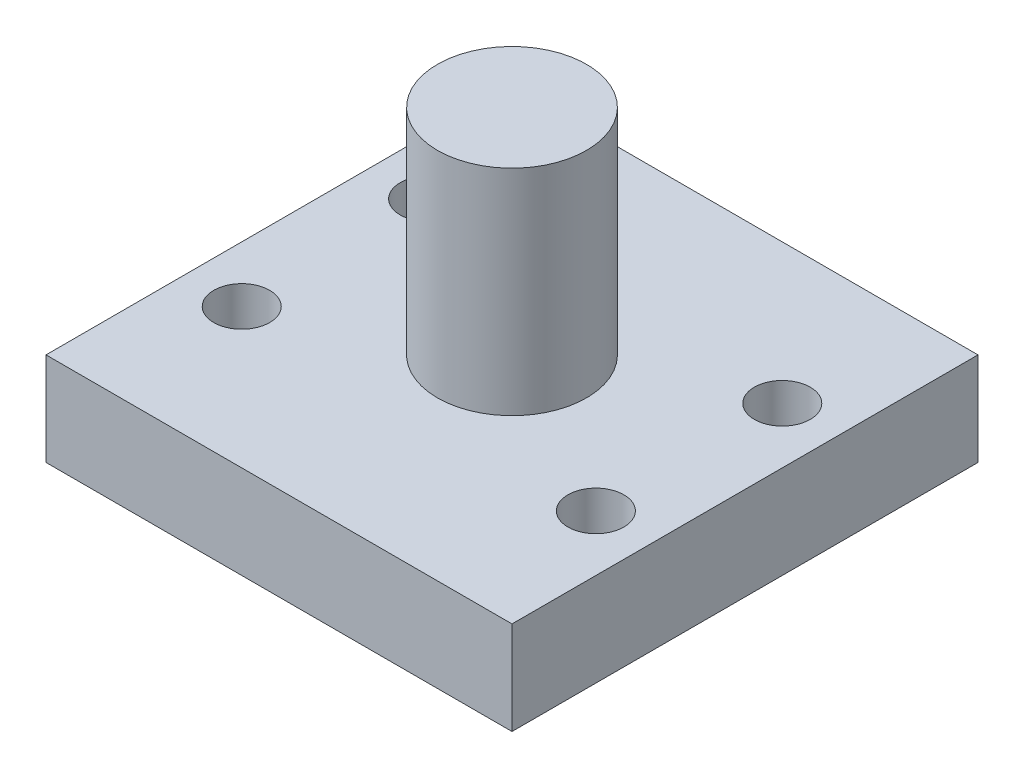
ISO-10303-21;
HEADER;
FILE_DESCRIPTION(('STEP AP214'),'2;1');
FILE_NAME('part.step','',(''),(''),'','','');
FILE_SCHEMA(('AUTOMOTIVE_DESIGN { 1 0 10303 214 1 1 1 1 }'));
ENDSEC;
DATA;
#1=APPLICATION_CONTEXT('core data for automotive mechanical design processes');
#2=APPLICATION_PROTOCOL_DEFINITION('international standard','automotive_design',2000,#1);
#3=PRODUCT_CONTEXT('',#1,'mechanical');
#4=PRODUCT('Part','Part','',(#3));
#5=PRODUCT_RELATED_PRODUCT_CATEGORY('part','',(#4));
#6=PRODUCT_DEFINITION_FORMATION('','',#4);
#7=PRODUCT_DEFINITION_CONTEXT('part definition',#1,'design');
#8=PRODUCT_DEFINITION('design','',#6,#7);
#9=PRODUCT_DEFINITION_SHAPE('','',#8);
#10=(LENGTH_UNIT() NAMED_UNIT(*) SI_UNIT(.MILLI.,.METRE.));
#11=(NAMED_UNIT(*) PLANE_ANGLE_UNIT() SI_UNIT($,.RADIAN.));
#12=(NAMED_UNIT(*) SI_UNIT($,.STERADIAN.) SOLID_ANGLE_UNIT());
#13=UNCERTAINTY_MEASURE_WITH_UNIT(LENGTH_MEASURE(1.E-05),#10,'distance_accuracy_value','');
#14=(GEOMETRIC_REPRESENTATION_CONTEXT(3) GLOBAL_UNCERTAINTY_ASSIGNED_CONTEXT((#13)) GLOBAL_UNIT_ASSIGNED_CONTEXT((#10,
#11,#12)) REPRESENTATION_CONTEXT('',''));
#15=CARTESIAN_POINT('',(0.,0.,0.));
#16=DIRECTION('',(0.,0.,1.));
#17=DIRECTION('',(1.,0.,0.));
#18=AXIS2_PLACEMENT_3D('',#15,#16,#17);
#19=CARTESIAN_POINT('',(0.,11.5,0.));
#20=DIRECTION('',(0.,-1.,0.));
#21=DIRECTION('',(0.,0.,-1.));
#22=AXIS2_PLACEMENT_3D('',#19,#20,#21);
#23=CYLINDRICAL_SURFACE('',#22,4.);
#24=CARTESIAN_POINT('',(0.,11.5,0.));
#25=DIRECTION('',(0.,1.,0.));
#26=DIRECTION('',(0.,0.,1.));
#27=AXIS2_PLACEMENT_3D('',#24,#25,#26);
#28=CIRCLE('',#27,4.);
#29=CARTESIAN_POINT('',(0.,11.5,4.));
#30=VERTEX_POINT('',#29);
#31=EDGE_CURVE('E11',#30,#30,#28,.T.);
#32=ORIENTED_EDGE('',*,*,#31,.F.);
#33=EDGE_LOOP('',(#32));
#34=FACE_BOUND('',#33,.T.);
#35=CARTESIAN_POINT('',(0.,0.,0.));
#36=DIRECTION('',(0.,1.,0.));
#37=DIRECTION('',(0.,0.,1.));
#38=AXIS2_PLACEMENT_3D('',#35,#36,#37);
#39=CIRCLE('',#38,4.);
#40=CARTESIAN_POINT('',(0.,0.,4.));
#41=VERTEX_POINT('',#40);
#42=EDGE_CURVE('E42',#41,#41,#39,.T.);
#43=ORIENTED_EDGE('',*,*,#42,.T.);
#44=EDGE_LOOP('',(#43));
#45=FACE_BOUND('',#44,.T.);
#46=ADVANCED_FACE('F39',(#34,#45),#23,.T.);
#47=CARTESIAN_POINT('',(0.,11.5,0.));
#48=DIRECTION('',(0.,1.,0.));
#49=DIRECTION('',(0.,0.,1.));
#50=AXIS2_PLACEMENT_3D('',#47,#48,#49);
#51=PLANE('',#50);
#52=ORIENTED_EDGE('',*,*,#31,.T.);
#53=EDGE_LOOP('',(#52));
#54=FACE_BOUND('',#53,.T.);
#55=ADVANCED_FACE('F152',(#54),#51,.T.);
#56=CARTESIAN_POINT('',(12.5,-5.,-12.5));
#57=DIRECTION('',(-1.,0.,0.));
#58=DIRECTION('',(0.,0.,1.));
#59=AXIS2_PLACEMENT_3D('',#56,#57,#58);
#60=PLANE('',#59);
#61=DIRECTION('',(0.,0.,1.));
#62=VECTOR('',#61,1.);
#63=CARTESIAN_POINT('',(12.5,0.,-12.5));
#64=LINE('',#63,#62);
#65=CARTESIAN_POINT('',(12.5,0.,-12.5));
#66=VERTEX_POINT('',#65);
#67=CARTESIAN_POINT('',(12.5,0.,12.5));
#68=VERTEX_POINT('',#67);
#69=EDGE_CURVE('E111',#66,#68,#64,.T.);
#70=ORIENTED_EDGE('',*,*,#69,.T.);
#71=DIRECTION('',(0.,1.,0.));
#72=VECTOR('',#71,1.);
#73=CARTESIAN_POINT('',(12.5,-5.,12.5));
#74=LINE('',#73,#72);
#75=CARTESIAN_POINT('',(12.5,-5.,12.5));
#76=VERTEX_POINT('',#75);
#77=EDGE_CURVE('E100',#76,#68,#74,.T.);
#78=ORIENTED_EDGE('',*,*,#77,.F.);
#79=DIRECTION('',(0.,0.,1.));
#80=VECTOR('',#79,1.);
#81=CARTESIAN_POINT('',(12.5,-5.,-12.5));
#82=LINE('',#81,#80);
#83=CARTESIAN_POINT('',(12.5,-5.,-12.5));
#84=VERTEX_POINT('',#83);
#85=EDGE_CURVE('E92',#84,#76,#82,.T.);
#86=ORIENTED_EDGE('',*,*,#85,.F.);
#87=DIRECTION('',(0.,1.,0.));
#88=VECTOR('',#87,1.);
#89=CARTESIAN_POINT('',(12.5,-5.,-12.5));
#90=LINE('',#89,#88);
#91=EDGE_CURVE('E107',#84,#66,#90,.T.);
#92=ORIENTED_EDGE('',*,*,#91,.T.);
#93=EDGE_LOOP('',(#70,#78,#86,#92));
#94=FACE_BOUND('',#93,.T.);
#95=ADVANCED_FACE('F140',(#94),#60,.F.);
#96=CARTESIAN_POINT('',(-12.5,-5.,12.5));
#97=DIRECTION('',(0.,0.,-1.));
#98=DIRECTION('',(-1.,0.,0.));
#99=AXIS2_PLACEMENT_3D('',#96,#97,#98);
#100=PLANE('',#99);
#101=DIRECTION('',(-1.,0.,0.));
#102=VECTOR('',#101,1.);
#103=CARTESIAN_POINT('',(-12.5,0.,12.5));
#104=LINE('',#103,#102);
#105=CARTESIAN_POINT('',(-12.5,0.,12.5));
#106=VERTEX_POINT('',#105);
#107=EDGE_CURVE('E98',#68,#106,#104,.T.);
#108=ORIENTED_EDGE('',*,*,#107,.T.);
#109=DIRECTION('',(0.,1.,0.));
#110=VECTOR('',#109,1.);
#111=CARTESIAN_POINT('',(-12.5,-5.,12.5));
#112=LINE('',#111,#110);
#113=CARTESIAN_POINT('',(-12.5,-5.,12.5));
#114=VERTEX_POINT('',#113);
#115=EDGE_CURVE('E96',#114,#106,#112,.T.);
#116=ORIENTED_EDGE('',*,*,#115,.F.);
#117=DIRECTION('',(-1.,0.,0.));
#118=VECTOR('',#117,1.);
#119=CARTESIAN_POINT('',(-12.5,-5.,12.5));
#120=LINE('',#119,#118);
#121=EDGE_CURVE('E87',#76,#114,#120,.T.);
#122=ORIENTED_EDGE('',*,*,#121,.F.);
#123=ORIENTED_EDGE('',*,*,#77,.T.);
#124=EDGE_LOOP('',(#108,#116,#122,#123));
#125=FACE_BOUND('',#124,.T.);
#126=ADVANCED_FACE('F97',(#125),#100,.F.);
#127=CARTESIAN_POINT('',(-12.5,-5.,-12.5));
#128=DIRECTION('',(1.,0.,0.));
#129=DIRECTION('',(0.,0.,-1.));
#130=AXIS2_PLACEMENT_3D('',#127,#128,#129);
#131=PLANE('',#130);
#132=DIRECTION('',(0.,0.,-1.));
#133=VECTOR('',#132,1.);
#134=CARTESIAN_POINT('',(-12.5,0.,-12.5));
#135=LINE('',#134,#133);
#136=CARTESIAN_POINT('',(-12.5,0.,-12.5));
#137=VERTEX_POINT('',#136);
#138=EDGE_CURVE('E73',#106,#137,#135,.T.);
#139=ORIENTED_EDGE('',*,*,#138,.T.);
#140=DIRECTION('',(0.,1.,0.));
#141=VECTOR('',#140,1.);
#142=CARTESIAN_POINT('',(-12.5,-5.,-12.5));
#143=LINE('',#142,#141);
#144=CARTESIAN_POINT('',(-12.5,-5.,-12.5));
#145=VERTEX_POINT('',#144);
#146=EDGE_CURVE('E101',#145,#137,#143,.T.);
#147=ORIENTED_EDGE('',*,*,#146,.F.);
#148=DIRECTION('',(0.,0.,-1.));
#149=VECTOR('',#148,1.);
#150=CARTESIAN_POINT('',(-12.5,-5.,-12.5));
#151=LINE('',#150,#149);
#152=EDGE_CURVE('E90',#114,#145,#151,.T.);
#153=ORIENTED_EDGE('',*,*,#152,.F.);
#154=ORIENTED_EDGE('',*,*,#115,.T.);
#155=EDGE_LOOP('',(#139,#147,#153,#154));
#156=FACE_BOUND('',#155,.T.);
#157=ADVANCED_FACE('F103',(#156),#131,.F.);
#158=CARTESIAN_POINT('',(-12.5,-5.,-12.5));
#159=DIRECTION('',(0.,0.,1.));
#160=DIRECTION('',(1.,0.,0.));
#161=AXIS2_PLACEMENT_3D('',#158,#159,#160);
#162=PLANE('',#161);
#163=DIRECTION('',(1.,0.,0.));
#164=VECTOR('',#163,1.);
#165=CARTESIAN_POINT('',(-12.5,0.,-12.5));
#166=LINE('',#165,#164);
#167=EDGE_CURVE('E79',#137,#66,#166,.T.);
#168=ORIENTED_EDGE('',*,*,#167,.T.);
#169=ORIENTED_EDGE('',*,*,#91,.F.);
#170=DIRECTION('',(1.,0.,0.));
#171=VECTOR('',#170,1.);
#172=CARTESIAN_POINT('',(-12.5,-5.,-12.5));
#173=LINE('',#172,#171);
#174=EDGE_CURVE('E56',#145,#84,#173,.T.);
#175=ORIENTED_EDGE('',*,*,#174,.F.);
#176=ORIENTED_EDGE('',*,*,#146,.T.);
#177=EDGE_LOOP('',(#168,#169,#175,#176));
#178=FACE_BOUND('',#177,.T.);
#179=ADVANCED_FACE('F141',(#178),#162,.F.);
#180=CARTESIAN_POINT('',(0.,-5.,0.));
#181=DIRECTION('',(0.,1.,0.));
#182=DIRECTION('',(0.,0.,1.));
#183=AXIS2_PLACEMENT_3D('',#180,#181,#182);
#184=PLANE('',#183);
#185=CARTESIAN_POINT('',(-9.5,-5.,-5.));
#186=DIRECTION('',(0.,1.,0.));
#187=DIRECTION('',(0.,0.,1.));
#188=AXIS2_PLACEMENT_3D('',#185,#186,#187);
#189=CIRCLE('',#188,1.5);
#190=CARTESIAN_POINT('',(-9.5,-5.,-3.5));
#191=VERTEX_POINT('',#190);
#192=EDGE_CURVE('E235',#191,#191,#189,.T.);
#193=ORIENTED_EDGE('',*,*,#192,.T.);
#194=EDGE_LOOP('',(#193));
#195=FACE_BOUND('',#194,.T.);
#196=CARTESIAN_POINT('',(-9.5,-5.,5.));
#197=DIRECTION('',(0.,1.,0.));
#198=DIRECTION('',(0.,0.,1.));
#199=AXIS2_PLACEMENT_3D('',#196,#197,#198);
#200=CIRCLE('',#199,1.5);
#201=CARTESIAN_POINT('',(-9.5,-5.,6.5));
#202=VERTEX_POINT('',#201);
#203=EDGE_CURVE('E261',#202,#202,#200,.T.);
#204=ORIENTED_EDGE('',*,*,#203,.T.);
#205=EDGE_LOOP('',(#204));
#206=FACE_BOUND('',#205,.T.);
#207=CARTESIAN_POINT('',(9.5,-5.,5.));
#208=DIRECTION('',(0.,1.,0.));
#209=DIRECTION('',(0.,0.,1.));
#210=AXIS2_PLACEMENT_3D('',#207,#208,#209);
#211=CIRCLE('',#210,1.5);
#212=CARTESIAN_POINT('',(9.5,-5.,6.5));
#213=VERTEX_POINT('',#212);
#214=EDGE_CURVE('E252',#213,#213,#211,.T.);
#215=ORIENTED_EDGE('',*,*,#214,.T.);
#216=EDGE_LOOP('',(#215));
#217=FACE_BOUND('',#216,.T.);
#218=CARTESIAN_POINT('',(9.5,-5.,-5.));
#219=DIRECTION('',(0.,1.,0.));
#220=DIRECTION('',(0.,0.,1.));
#221=AXIS2_PLACEMENT_3D('',#218,#219,#220);
#222=CIRCLE('',#221,1.5);
#223=CARTESIAN_POINT('',(9.5,-5.,-3.5));
#224=VERTEX_POINT('',#223);
#225=EDGE_CURVE('E115',#224,#224,#222,.T.);
#226=ORIENTED_EDGE('',*,*,#225,.T.);
#227=EDGE_LOOP('',(#226));
#228=FACE_BOUND('',#227,.T.);
#229=ORIENTED_EDGE('',*,*,#85,.T.);
#230=ORIENTED_EDGE('',*,*,#121,.T.);
#231=ORIENTED_EDGE('',*,*,#152,.T.);
#232=ORIENTED_EDGE('',*,*,#174,.T.);
#233=EDGE_LOOP('',(#229,#230,#231,#232));
#234=FACE_BOUND('',#233,.T.);
#235=ADVANCED_FACE('F88',(#195,#206,#217,#228,#234),#184,.F.);
#236=CARTESIAN_POINT('',(0.,0.,0.));
#237=DIRECTION('',(0.,1.,0.));
#238=DIRECTION('',(0.,0.,1.));
#239=AXIS2_PLACEMENT_3D('',#236,#237,#238);
#240=PLANE('',#239);
#241=CARTESIAN_POINT('',(-9.5,0.,-5.));
#242=DIRECTION('',(0.,1.,0.));
#243=DIRECTION('',(0.,0.,1.));
#244=AXIS2_PLACEMENT_3D('',#241,#242,#243);
#245=CIRCLE('',#244,1.5);
#246=CARTESIAN_POINT('',(-9.5,0.,-3.5));
#247=VERTEX_POINT('',#246);
#248=EDGE_CURVE('E238',#247,#247,#245,.T.);
#249=ORIENTED_EDGE('',*,*,#248,.F.);
#250=EDGE_LOOP('',(#249));
#251=FACE_BOUND('',#250,.T.);
#252=CARTESIAN_POINT('',(-9.5,0.,5.));
#253=DIRECTION('',(0.,1.,0.));
#254=DIRECTION('',(0.,0.,1.));
#255=AXIS2_PLACEMENT_3D('',#252,#253,#254);
#256=CIRCLE('',#255,1.5);
#257=CARTESIAN_POINT('',(-9.5,0.,6.5));
#258=VERTEX_POINT('',#257);
#259=EDGE_CURVE('E242',#258,#258,#256,.T.);
#260=ORIENTED_EDGE('',*,*,#259,.F.);
#261=EDGE_LOOP('',(#260));
#262=FACE_BOUND('',#261,.T.);
#263=CARTESIAN_POINT('',(9.5,0.,5.));
#264=DIRECTION('',(0.,1.,0.));
#265=DIRECTION('',(0.,0.,1.));
#266=AXIS2_PLACEMENT_3D('',#263,#264,#265);
#267=CIRCLE('',#266,1.5);
#268=CARTESIAN_POINT('',(9.5,0.,6.5));
#269=VERTEX_POINT('',#268);
#270=EDGE_CURVE('E257',#269,#269,#267,.T.);
#271=ORIENTED_EDGE('',*,*,#270,.F.);
#272=EDGE_LOOP('',(#271));
#273=FACE_BOUND('',#272,.T.);
#274=CARTESIAN_POINT('',(9.5,0.,-5.));
#275=DIRECTION('',(0.,1.,0.));
#276=DIRECTION('',(0.,0.,1.));
#277=AXIS2_PLACEMENT_3D('',#274,#275,#276);
#278=CIRCLE('',#277,1.5);
#279=CARTESIAN_POINT('',(9.5,0.,-3.5));
#280=VERTEX_POINT('',#279);
#281=EDGE_CURVE('E249',#280,#280,#278,.T.);
#282=ORIENTED_EDGE('',*,*,#281,.F.);
#283=EDGE_LOOP('',(#282));
#284=FACE_BOUND('',#283,.T.);
#285=ORIENTED_EDGE('',*,*,#42,.F.);
#286=EDGE_LOOP('',(#285));
#287=FACE_BOUND('',#286,.T.);
#288=ORIENTED_EDGE('',*,*,#69,.F.);
#289=ORIENTED_EDGE('',*,*,#167,.F.);
#290=ORIENTED_EDGE('',*,*,#138,.F.);
#291=ORIENTED_EDGE('',*,*,#107,.F.);
#292=EDGE_LOOP('',(#288,#289,#290,#291));
#293=FACE_BOUND('',#292,.T.);
#294=ADVANCED_FACE('F132',(#251,#262,#273,#284,#287,#293),#240,.T.);
#295=CARTESIAN_POINT('',(9.5,-5.,-5.));
#296=DIRECTION('',(0.,1.,0.));
#297=DIRECTION('',(0.,0.,1.));
#298=AXIS2_PLACEMENT_3D('',#295,#296,#297);
#299=CYLINDRICAL_SURFACE('',#298,1.5);
#300=ORIENTED_EDGE('',*,*,#225,.F.);
#301=EDGE_LOOP('',(#300));
#302=FACE_BOUND('',#301,.T.);
#303=ORIENTED_EDGE('',*,*,#281,.T.);
#304=EDGE_LOOP('',(#303));
#305=FACE_BOUND('',#304,.T.);
#306=ADVANCED_FACE('F135',(#302,#305),#299,.F.);
#307=CARTESIAN_POINT('',(9.5,-5.,5.));
#308=DIRECTION('',(0.,1.,0.));
#309=DIRECTION('',(0.,0.,1.));
#310=AXIS2_PLACEMENT_3D('',#307,#308,#309);
#311=CYLINDRICAL_SURFACE('',#310,1.5);
#312=ORIENTED_EDGE('',*,*,#214,.F.);
#313=EDGE_LOOP('',(#312));
#314=FACE_BOUND('',#313,.T.);
#315=ORIENTED_EDGE('',*,*,#270,.T.);
#316=EDGE_LOOP('',(#315));
#317=FACE_BOUND('',#316,.T.);
#318=ADVANCED_FACE('F198',(#314,#317),#311,.F.);
#319=CARTESIAN_POINT('',(-9.5,-5.,5.));
#320=DIRECTION('',(0.,1.,0.));
#321=DIRECTION('',(0.,0.,1.));
#322=AXIS2_PLACEMENT_3D('',#319,#320,#321);
#323=CYLINDRICAL_SURFACE('',#322,1.5);
#324=ORIENTED_EDGE('',*,*,#203,.F.);
#325=EDGE_LOOP('',(#324));
#326=FACE_BOUND('',#325,.T.);
#327=ORIENTED_EDGE('',*,*,#259,.T.);
#328=EDGE_LOOP('',(#327));
#329=FACE_BOUND('',#328,.T.);
#330=ADVANCED_FACE('F208',(#326,#329),#323,.F.);
#331=CARTESIAN_POINT('',(-9.5,-5.,-5.));
#332=DIRECTION('',(0.,1.,0.));
#333=DIRECTION('',(0.,0.,1.));
#334=AXIS2_PLACEMENT_3D('',#331,#332,#333);
#335=CYLINDRICAL_SURFACE('',#334,1.5);
#336=ORIENTED_EDGE('',*,*,#192,.F.);
#337=EDGE_LOOP('',(#336));
#338=FACE_BOUND('',#337,.T.);
#339=ORIENTED_EDGE('',*,*,#248,.T.);
#340=EDGE_LOOP('',(#339));
#341=FACE_BOUND('',#340,.T.);
#342=ADVANCED_FACE('F218',(#338,#341),#335,.F.);
#343=CLOSED_SHELL('',(#46,#55,#95,#126,#157,#179,#235,#294,#306,#318,#330,#342));
#344=MANIFOLD_SOLID_BREP('B2',#343);
#345=ADVANCED_BREP_SHAPE_REPRESENTATION('',(#18,#344),#14);
#346=SHAPE_DEFINITION_REPRESENTATION(#9,#345);
ENDSEC;
END-ISO-10303-21;
